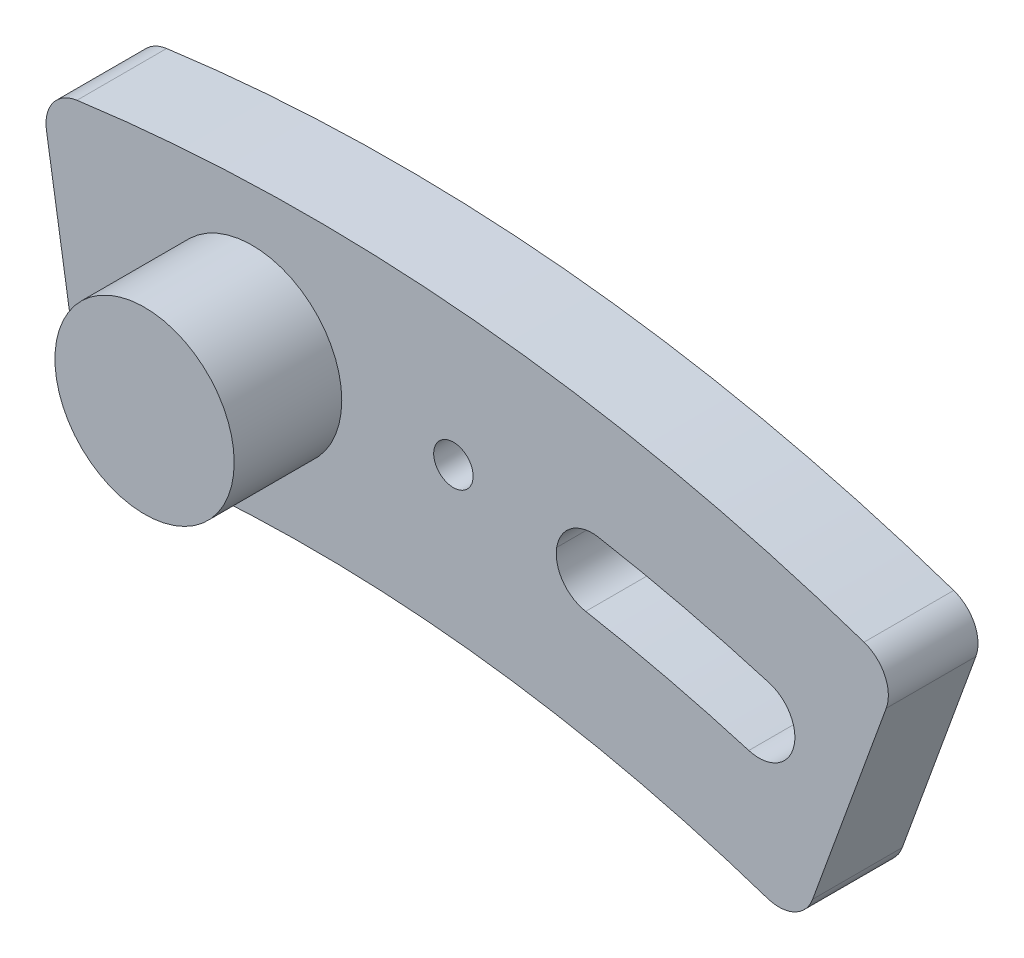
ISO-10303-21;
HEADER;
FILE_DESCRIPTION(('STEP AP214'),'2;1');
FILE_NAME('part.step','',(''),(''),'','','');
FILE_SCHEMA(('AUTOMOTIVE_DESIGN { 1 0 10303 214 1 1 1 1 }'));
ENDSEC;
DATA;
#1=APPLICATION_CONTEXT('core data for automotive mechanical design processes');
#2=APPLICATION_PROTOCOL_DEFINITION('international standard','automotive_design',2000,#1);
#3=PRODUCT_CONTEXT('',#1,'mechanical');
#4=PRODUCT('Part','Part','',(#3));
#5=PRODUCT_RELATED_PRODUCT_CATEGORY('part','',(#4));
#6=PRODUCT_DEFINITION_FORMATION('','',#4);
#7=PRODUCT_DEFINITION_CONTEXT('part definition',#1,'design');
#8=PRODUCT_DEFINITION('design','',#6,#7);
#9=PRODUCT_DEFINITION_SHAPE('','',#8);
#10=(LENGTH_UNIT() NAMED_UNIT(*) SI_UNIT(.MILLI.,.METRE.));
#11=(NAMED_UNIT(*) PLANE_ANGLE_UNIT() SI_UNIT($,.RADIAN.));
#12=(NAMED_UNIT(*) SI_UNIT($,.STERADIAN.) SOLID_ANGLE_UNIT());
#13=UNCERTAINTY_MEASURE_WITH_UNIT(LENGTH_MEASURE(1.E-05),#10,'distance_accuracy_value','');
#14=(GEOMETRIC_REPRESENTATION_CONTEXT(3) GLOBAL_UNCERTAINTY_ASSIGNED_CONTEXT((#13)) GLOBAL_UNIT_ASSIGNED_CONTEXT((#10,
#11,#12)) REPRESENTATION_CONTEXT('',''));
#15=CARTESIAN_POINT('',(0.,0.,0.));
#16=DIRECTION('',(0.,0.,1.));
#17=DIRECTION('',(1.,0.,0.));
#18=AXIS2_PLACEMENT_3D('',#15,#16,#17);
#19=CARTESIAN_POINT('',(-1.40859546249317E-12,2.51187959321442E-12,5.));
#20=DIRECTION('',(0.,0.,1.));
#21=DIRECTION('',(1.,0.,0.));
#22=AXIS2_PLACEMENT_3D('',#19,#20,#21);
#23=PLANE('',#22);
#24=CARTESIAN_POINT('',(-3.22698514229599,88.0000000000025,5.));
#25=DIRECTION('',(0.,0.,1.));
#26=DIRECTION('',(1.,0.,0.));
#27=AXIS2_PLACEMENT_3D('',#24,#25,#26);
#28=CIRCLE('',#27,5.);
#29=CARTESIAN_POINT('',(1.77301485770401,88.0000000000025,5.));
#30=VERTEX_POINT('',#29);
#31=EDGE_CURVE('E160',#30,#30,#28,.F.);
#32=ORIENTED_EDGE('',*,*,#31,.T.);
#33=EDGE_LOOP('',(#32));
#34=FACE_BOUND('',#33,.T.);
#35=DIRECTION('',(0.156434465040231,-0.987688340595138,0.));
#36=VECTOR('',#35,1.);
#37=CARTESIAN_POINT('',(-15.0177086438636,94.8180806971357,5.));
#38=LINE('',#37,#36);
#39=CARTESIAN_POINT('',(-14.7015109441392,92.8216869915639,5.));
#40=VERTEX_POINT('',#39);
#41=CARTESIAN_POINT('',(-12.8238100909332,80.9663503855282,5.));
#42=VERTEX_POINT('',#41);
#43=EDGE_CURVE('E195',#40,#42,#38,.T.);
#44=ORIENTED_EDGE('',*,*,#43,.T.);
#45=CARTESIAN_POINT('',(-10.8484334097429,81.2792193156087,5.));
#46=DIRECTION('',(0.,0.,1.));
#47=DIRECTION('',(1.,0.,0.));
#48=AXIS2_PLACEMENT_3D('',#45,#46,#47);
#49=CIRCLE('',#48,2.);
#50=CARTESIAN_POINT('',(-10.58383747292,79.2967993323012,5.));
#51=VERTEX_POINT('',#50);
#52=EDGE_CURVE('E238',#42,#51,#49,.T.);
#53=ORIENTED_EDGE('',*,*,#52,.T.);
#54=CARTESIAN_POINT('',(-1.40859546249317E-12,2.51187959321442E-12,5.));
#55=DIRECTION('',(0.,0.,1.));
#56=DIRECTION('',(1.,0.,0.));
#57=AXIS2_PLACEMENT_3D('',#54,#55,#56);
#58=CIRCLE('',#57,80.);
#59=CARTESIAN_POINT('',(25.5199251857789,75.8204023895453,5.));
#60=VERTEX_POINT('',#59);
#61=EDGE_CURVE('E147',#60,#51,#58,.T.);
#62=ORIENTED_EDGE('',*,*,#61,.F.);
#63=CARTESIAN_POINT('',(26.1579233154234,77.7159124492838,5.));
#64=DIRECTION('',(0.,0.,1.));
#65=DIRECTION('',(1.,0.,0.));
#66=AXIS2_PLACEMENT_3D('',#63,#64,#65);
#67=CIRCLE('',#66,2.);
#68=CARTESIAN_POINT('',(28.0373085569952,77.0318721626325,5.));
#69=VERTEX_POINT('',#68);
#70=EDGE_CURVE('E234',#60,#69,#67,.T.);
#71=ORIENTED_EDGE('',*,*,#70,.T.);
#72=DIRECTION('',(0.342020143325669,0.939692620785908,0.));
#73=VECTOR('',#72,1.);
#74=CARTESIAN_POINT('',(27.3616114660521,75.1754096628752,5.));
#75=LINE('',#74,#73);
#76=CARTESIAN_POINT('',(32.1426156245335,88.3111106306214,5.));
#77=VERTEX_POINT('',#76);
#78=EDGE_CURVE('E188',#69,#77,#75,.T.);
#79=ORIENTED_EDGE('',*,*,#78,.T.);
#80=CARTESIAN_POINT('',(30.2632303829617,88.9951509172727,5.));
#81=DIRECTION('',(0.,0.,1.));
#82=DIRECTION('',(1.,0.,0.));
#83=AXIS2_PLACEMENT_3D('',#80,#81,#82);
#84=CIRCLE('',#83,2.);
#85=CARTESIAN_POINT('',(30.9071289017482,90.8886647665764,5.));
#86=VERTEX_POINT('',#85);
#87=EDGE_CURVE('E232',#77,#86,#84,.T.);
#88=ORIENTED_EDGE('',*,*,#87,.T.);
#89=CARTESIAN_POINT('',(-1.40859546249317E-12,2.51187959321442E-12,5.));
#90=DIRECTION('',(0.,0.,1.));
#91=DIRECTION('',(1.,0.,0.));
#92=AXIS2_PLACEMENT_3D('',#89,#90,#91);
#93=CIRCLE('',#92,96.);
#94=CARTESIAN_POINT('',(-12.9969030770542,95.1161422178495,5.));
#95=VERTEX_POINT('',#94);
#96=EDGE_CURVE('E191',#86,#95,#93,.T.);
#97=ORIENTED_EDGE('',*,*,#96,.T.);
#98=CARTESIAN_POINT('',(-12.7261342629489,93.1345559216444,5.));
#99=DIRECTION('',(0.,0.,1.));
#100=DIRECTION('',(1.,0.,0.));
#101=AXIS2_PLACEMENT_3D('',#98,#99,#100);
#102=CIRCLE('',#101,2.);
#103=EDGE_CURVE('E236',#95,#40,#102,.T.);
#104=ORIENTED_EDGE('',*,*,#103,.T.);
#105=EDGE_LOOP('',(#44,#53,#62,#71,#79,#88,#97,#104));
#106=FACE_BOUND('',#105,.T.);
#107=CARTESIAN_POINT('',(7.99999999999859,88.0000000000025,5.));
#108=DIRECTION('',(0.,0.,1.));
#109=DIRECTION('',(1.,0.,0.));
#110=AXIS2_PLACEMENT_3D('',#107,#108,#109);
#111=CIRCLE('',#110,1.10000000000062);
#112=CARTESIAN_POINT('',(9.09999999999921,88.0000000000025,5.));
#113=VERTEX_POINT('',#112);
#114=EDGE_CURVE('E153',#113,#113,#111,.F.);
#115=ORIENTED_EDGE('',*,*,#114,.T.);
#116=EDGE_LOOP('',(#115));
#117=FACE_BOUND('',#116,.T.);
#118=CARTESIAN_POINT('',(-1.40859546249317E-12,2.51187959321442E-12,5.));
#119=DIRECTION('',(0.,0.,1.));
#120=DIRECTION('',(1.,0.,0.));
#121=AXIS2_PLACEMENT_3D('',#118,#119,#120);
#122=CIRCLE('',#121,90.);
#123=CARTESIAN_POINT('',(16.0957368580438,88.5490104687625,5.));
#124=VERTEX_POINT('',#123);
#125=CARTESIAN_POINT('',(25.6174844033101,86.2771377182074,5.));
#126=VERTEX_POINT('',#125);
#127=EDGE_CURVE('E152',#124,#126,#122,.F.);
#128=ORIENTED_EDGE('',*,*,#127,.T.);
#129=CARTESIAN_POINT('',(25.0482069721254,84.3598679911362,5.));
#130=DIRECTION('',(0.,0.,1.));
#131=DIRECTION('',(1.,0.,0.));
#132=AXIS2_PLACEMENT_3D('',#129,#130,#131);
#133=CIRCLE('',#132,2.);
#134=CARTESIAN_POINT('',(26.9520433491665,83.7471632910931,5.));
#135=VERTEX_POINT('',#134);
#136=EDGE_CURVE('E169',#126,#135,#133,.F.);
#137=ORIENTED_EDGE('',*,*,#136,.T.);
#138=CARTESIAN_POINT('',(25.0482069721254,84.3598679911362,5.));
#139=DIRECTION('',(0.,0.,1.));
#140=DIRECTION('',(1.,0.,0.));
#141=AXIS2_PLACEMENT_3D('',#138,#139,#140);
#142=CIRCLE('',#141,2.);
#143=CARTESIAN_POINT('',(24.4789295409407,82.442598264065,5.));
#144=VERTEX_POINT('',#143);
#145=EDGE_CURVE('E151',#135,#144,#142,.F.);
#146=ORIENTED_EDGE('',*,*,#145,.T.);
#147=CARTESIAN_POINT('',(-1.40859546249317E-12,2.51187959321442E-12,5.));
#148=DIRECTION('',(0.,0.,1.));
#149=DIRECTION('',(1.,0.,0.));
#150=AXIS2_PLACEMENT_3D('',#147,#148,#149);
#151=CIRCLE('',#150,86.);
#152=CARTESIAN_POINT('',(15.380370775464,84.6134988923732,5.));
#153=VERTEX_POINT('',#152);
#154=EDGE_CURVE('E141',#153,#144,#151,.F.);
#155=ORIENTED_EDGE('',*,*,#154,.F.);
#156=CARTESIAN_POINT('',(15.7380538167539,86.5812546805678,5.));
#157=DIRECTION('',(0.,0.,1.));
#158=DIRECTION('',(1.,0.,0.));
#159=AXIS2_PLACEMENT_3D('',#156,#157,#158);
#160=CIRCLE('',#159,2.);
#161=CARTESIAN_POINT('',(13.7626771355636,86.8941236106483,5.));
#162=VERTEX_POINT('',#161);
#163=EDGE_CURVE('E11',#153,#162,#160,.F.);
#164=ORIENTED_EDGE('',*,*,#163,.T.);
#165=CARTESIAN_POINT('',(15.7380538167539,86.5812546805679,5.));
#166=DIRECTION('',(0.,0.,1.));
#167=DIRECTION('',(1.,0.,0.));
#168=AXIS2_PLACEMENT_3D('',#165,#166,#167);
#169=CIRCLE('',#168,2.);
#170=EDGE_CURVE('E162',#162,#124,#169,.F.);
#171=ORIENTED_EDGE('',*,*,#170,.T.);
#172=EDGE_LOOP('',(#128,#137,#146,#155,#164,#171));
#173=FACE_BOUND('',#172,.T.);
#174=ADVANCED_FACE('F35',(#34,#106,#117,#173),#23,.T.);
#175=CARTESIAN_POINT('',(-1.40859546249317E-12,2.51187959321442E-12,0.));
#176=DIRECTION('',(0.,0.,1.));
#177=DIRECTION('',(1.,0.,0.));
#178=AXIS2_PLACEMENT_3D('',#175,#176,#177);
#179=PLANE('',#178);
#180=CARTESIAN_POINT('',(7.99999999999859,88.0000000000025,0.));
#181=DIRECTION('',(0.,0.,1.));
#182=DIRECTION('',(1.,0.,0.));
#183=AXIS2_PLACEMENT_3D('',#180,#181,#182);
#184=CIRCLE('',#183,1.10000000000062);
#185=CARTESIAN_POINT('',(9.09999999999921,88.0000000000025,0.));
#186=VERTEX_POINT('',#185);
#187=EDGE_CURVE('E173',#186,#186,#184,.T.);
#188=ORIENTED_EDGE('',*,*,#187,.T.);
#189=EDGE_LOOP('',(#188));
#190=FACE_BOUND('',#189,.T.);
#191=CARTESIAN_POINT('',(-1.40859546249317E-12,2.51187959321442E-12,0.));
#192=DIRECTION('',(0.,0.,1.));
#193=DIRECTION('',(1.,0.,0.));
#194=AXIS2_PLACEMENT_3D('',#191,#192,#193);
#195=CIRCLE('',#194,80.);
#196=CARTESIAN_POINT('',(25.5199251857789,75.8204023895453,0.));
#197=VERTEX_POINT('',#196);
#198=CARTESIAN_POINT('',(-10.58383747292,79.2967993323012,0.));
#199=VERTEX_POINT('',#198);
#200=EDGE_CURVE('E192',#197,#199,#195,.T.);
#201=ORIENTED_EDGE('',*,*,#200,.T.);
#202=CARTESIAN_POINT('',(-10.8484334097429,81.2792193156087,0.));
#203=DIRECTION('',(0.,0.,1.));
#204=DIRECTION('',(1.,0.,0.));
#205=AXIS2_PLACEMENT_3D('',#202,#203,#204);
#206=CIRCLE('',#205,2.);
#207=CARTESIAN_POINT('',(-12.8238100909332,80.9663503855282,0.));
#208=VERTEX_POINT('',#207);
#209=EDGE_CURVE('E225',#199,#208,#206,.F.);
#210=ORIENTED_EDGE('',*,*,#209,.T.);
#211=DIRECTION('',(0.156434465040231,-0.987688340595138,0.));
#212=VECTOR('',#211,1.);
#213=CARTESIAN_POINT('',(-15.0177086438636,94.8180806971357,0.));
#214=LINE('',#213,#212);
#215=CARTESIAN_POINT('',(-14.7015109441392,92.8216869915639,0.));
#216=VERTEX_POINT('',#215);
#217=EDGE_CURVE('E205',#216,#208,#214,.T.);
#218=ORIENTED_EDGE('',*,*,#217,.F.);
#219=CARTESIAN_POINT('',(-12.7261342629489,93.1345559216444,0.));
#220=DIRECTION('',(0.,0.,1.));
#221=DIRECTION('',(1.,0.,0.));
#222=AXIS2_PLACEMENT_3D('',#219,#220,#221);
#223=CIRCLE('',#222,2.);
#224=CARTESIAN_POINT('',(-12.9969030770542,95.1161422178495,0.));
#225=VERTEX_POINT('',#224);
#226=EDGE_CURVE('E223',#216,#225,#223,.F.);
#227=ORIENTED_EDGE('',*,*,#226,.T.);
#228=CARTESIAN_POINT('',(-1.40859546249317E-12,2.51187959321442E-12,0.));
#229=DIRECTION('',(0.,0.,1.));
#230=DIRECTION('',(1.,0.,0.));
#231=AXIS2_PLACEMENT_3D('',#228,#229,#230);
#232=CIRCLE('',#231,96.);
#233=CARTESIAN_POINT('',(30.9071289017482,90.8886647665764,0.));
#234=VERTEX_POINT('',#233);
#235=EDGE_CURVE('E202',#234,#225,#232,.T.);
#236=ORIENTED_EDGE('',*,*,#235,.F.);
#237=CARTESIAN_POINT('',(30.2632303829617,88.9951509172727,0.));
#238=DIRECTION('',(0.,0.,1.));
#239=DIRECTION('',(1.,0.,0.));
#240=AXIS2_PLACEMENT_3D('',#237,#238,#239);
#241=CIRCLE('',#240,2.);
#242=CARTESIAN_POINT('',(32.1426156245335,88.3111106306214,0.));
#243=VERTEX_POINT('',#242);
#244=EDGE_CURVE('E219',#234,#243,#241,.F.);
#245=ORIENTED_EDGE('',*,*,#244,.T.);
#246=DIRECTION('',(0.342020143325669,0.939692620785908,0.));
#247=VECTOR('',#246,1.);
#248=CARTESIAN_POINT('',(27.3616114660521,75.1754096628752,0.));
#249=LINE('',#248,#247);
#250=CARTESIAN_POINT('',(28.0373085569952,77.0318721626325,0.));
#251=VERTEX_POINT('',#250);
#252=EDGE_CURVE('E187',#251,#243,#249,.T.);
#253=ORIENTED_EDGE('',*,*,#252,.F.);
#254=CARTESIAN_POINT('',(26.1579233154234,77.7159124492838,0.));
#255=DIRECTION('',(0.,0.,1.));
#256=DIRECTION('',(1.,0.,0.));
#257=AXIS2_PLACEMENT_3D('',#254,#255,#256);
#258=CIRCLE('',#257,2.);
#259=EDGE_CURVE('E221',#251,#197,#258,.F.);
#260=ORIENTED_EDGE('',*,*,#259,.T.);
#261=EDGE_LOOP('',(#201,#210,#218,#227,#236,#245,#253,#260));
#262=FACE_BOUND('',#261,.T.);
#263=CARTESIAN_POINT('',(25.0482069721254,84.3598679911362,0.));
#264=DIRECTION('',(0.,0.,1.));
#265=DIRECTION('',(1.,0.,0.));
#266=AXIS2_PLACEMENT_3D('',#263,#264,#265);
#267=CIRCLE('',#266,2.);
#268=CARTESIAN_POINT('',(24.4789295409407,82.442598264065,0.));
#269=VERTEX_POINT('',#268);
#270=CARTESIAN_POINT('',(26.9520433491665,83.7471632910931,0.));
#271=VERTEX_POINT('',#270);
#272=EDGE_CURVE('E250',#269,#271,#267,.T.);
#273=ORIENTED_EDGE('',*,*,#272,.T.);
#274=CARTESIAN_POINT('',(25.0482069721254,84.3598679911362,0.));
#275=DIRECTION('',(0.,0.,1.));
#276=DIRECTION('',(1.,0.,0.));
#277=AXIS2_PLACEMENT_3D('',#274,#275,#276);
#278=CIRCLE('',#277,2.);
#279=CARTESIAN_POINT('',(25.6174844033101,86.2771377182074,0.));
#280=VERTEX_POINT('',#279);
#281=EDGE_CURVE('E253',#271,#280,#278,.T.);
#282=ORIENTED_EDGE('',*,*,#281,.T.);
#283=CARTESIAN_POINT('',(-1.40859546249317E-12,2.51187959321442E-12,0.));
#284=DIRECTION('',(0.,0.,1.));
#285=DIRECTION('',(1.,0.,0.));
#286=AXIS2_PLACEMENT_3D('',#283,#284,#285);
#287=CIRCLE('',#286,90.);
#288=CARTESIAN_POINT('',(16.0957368580438,88.5490104687625,0.));
#289=VERTEX_POINT('',#288);
#290=EDGE_CURVE('E177',#280,#289,#287,.T.);
#291=ORIENTED_EDGE('',*,*,#290,.T.);
#292=CARTESIAN_POINT('',(15.7380538167539,86.5812546805679,0.));
#293=DIRECTION('',(0.,0.,1.));
#294=DIRECTION('',(1.,0.,0.));
#295=AXIS2_PLACEMENT_3D('',#292,#293,#294);
#296=CIRCLE('',#295,2.);
#297=CARTESIAN_POINT('',(13.7626771355636,86.8941236106483,0.));
#298=VERTEX_POINT('',#297);
#299=EDGE_CURVE('E58',#289,#298,#296,.T.);
#300=ORIENTED_EDGE('',*,*,#299,.T.);
#301=CARTESIAN_POINT('',(15.7380538167539,86.5812546805678,0.));
#302=DIRECTION('',(0.,0.,1.));
#303=DIRECTION('',(1.,0.,0.));
#304=AXIS2_PLACEMENT_3D('',#301,#302,#303);
#305=CIRCLE('',#304,2.);
#306=CARTESIAN_POINT('',(15.380370775464,84.6134988923732,0.));
#307=VERTEX_POINT('',#306);
#308=EDGE_CURVE('E44',#298,#307,#305,.T.);
#309=ORIENTED_EDGE('',*,*,#308,.T.);
#310=CARTESIAN_POINT('',(-1.40859546249317E-12,2.51187959321442E-12,0.));
#311=DIRECTION('',(0.,0.,1.));
#312=DIRECTION('',(1.,0.,0.));
#313=AXIS2_PLACEMENT_3D('',#310,#311,#312);
#314=CIRCLE('',#313,86.);
#315=EDGE_CURVE('E144',#269,#307,#314,.T.);
#316=ORIENTED_EDGE('',*,*,#315,.F.);
#317=EDGE_LOOP('',(#273,#282,#291,#300,#309,#316));
#318=FACE_BOUND('',#317,.T.);
#319=ADVANCED_FACE('F260',(#190,#262,#318),#179,.F.);
#320=CARTESIAN_POINT('',(27.3616114660521,75.1754096628752,5.));
#321=DIRECTION('',(-0.939692620785908,0.342020143325669,0.));
#322=DIRECTION('',(-0.342020143325669,-0.939692620785908,0.));
#323=AXIS2_PLACEMENT_3D('',#320,#321,#322);
#324=PLANE('',#323);
#325=ORIENTED_EDGE('',*,*,#78,.F.);
#326=DIRECTION('',(0.,0.,1.));
#327=VECTOR('',#326,1.);
#328=CARTESIAN_POINT('',(28.0373085569952,77.0318721626325,0.));
#329=LINE('',#328,#327);
#330=EDGE_CURVE('E247',#69,#251,#329,.F.);
#331=ORIENTED_EDGE('',*,*,#330,.T.);
#332=ORIENTED_EDGE('',*,*,#252,.T.);
#333=DIRECTION('',(0.,0.,-1.));
#334=VECTOR('',#333,1.);
#335=CARTESIAN_POINT('',(32.1426156245335,88.3111106306214,5.));
#336=LINE('',#335,#334);
#337=EDGE_CURVE('E245',#243,#77,#336,.F.);
#338=ORIENTED_EDGE('',*,*,#337,.T.);
#339=EDGE_LOOP('',(#325,#331,#332,#338));
#340=FACE_BOUND('',#339,.T.);
#341=ADVANCED_FACE('F281',(#340),#324,.F.);
#342=CARTESIAN_POINT('',(-1.40859546249317E-12,2.51187959321442E-12,5.));
#343=DIRECTION('',(0.,0.,-1.));
#344=DIRECTION('',(-1.,0.,0.));
#345=AXIS2_PLACEMENT_3D('',#342,#343,#344);
#346=CYLINDRICAL_SURFACE('',#345,96.);
#347=ORIENTED_EDGE('',*,*,#235,.T.);
#348=DIRECTION('',(0.,0.,-1.));
#349=VECTOR('',#348,1.);
#350=CARTESIAN_POINT('',(-12.9969030770542,95.1161422178495,5.));
#351=LINE('',#350,#349);
#352=EDGE_CURVE('E243',#225,#95,#351,.F.);
#353=ORIENTED_EDGE('',*,*,#352,.T.);
#354=ORIENTED_EDGE('',*,*,#96,.F.);
#355=DIRECTION('',(0.,0.,-1.));
#356=VECTOR('',#355,1.);
#357=CARTESIAN_POINT('',(30.9071289017482,90.8886647665763,5.));
#358=LINE('',#357,#356);
#359=EDGE_CURVE('E240',#86,#234,#358,.T.);
#360=ORIENTED_EDGE('',*,*,#359,.T.);
#361=EDGE_LOOP('',(#347,#353,#354,#360));
#362=FACE_BOUND('',#361,.T.);
#363=ADVANCED_FACE('F292',(#362),#346,.T.);
#364=CARTESIAN_POINT('',(-15.0177086438636,94.8180806971357,5.));
#365=DIRECTION('',(0.987688340595138,0.156434465040231,0.));
#366=DIRECTION('',(-0.156434465040231,0.987688340595138,0.));
#367=AXIS2_PLACEMENT_3D('',#364,#365,#366);
#368=PLANE('',#367);
#369=ORIENTED_EDGE('',*,*,#217,.T.);
#370=DIRECTION('',(0.,0.,1.));
#371=VECTOR('',#370,1.);
#372=CARTESIAN_POINT('',(-12.8238100909332,80.9663503855282,5.));
#373=LINE('',#372,#371);
#374=EDGE_CURVE('E230',#208,#42,#373,.T.);
#375=ORIENTED_EDGE('',*,*,#374,.T.);
#376=ORIENTED_EDGE('',*,*,#43,.F.);
#377=DIRECTION('',(0.,0.,-1.));
#378=VECTOR('',#377,1.);
#379=CARTESIAN_POINT('',(-14.7015109441392,92.8216869915639,5.));
#380=LINE('',#379,#378);
#381=EDGE_CURVE('E227',#40,#216,#380,.T.);
#382=ORIENTED_EDGE('',*,*,#381,.T.);
#383=EDGE_LOOP('',(#369,#375,#376,#382));
#384=FACE_BOUND('',#383,.T.);
#385=ADVANCED_FACE('F288',(#384),#368,.F.);
#386=CARTESIAN_POINT('',(-1.40859546249317E-12,2.51187959321442E-12,5.));
#387=DIRECTION('',(0.,0.,-1.));
#388=DIRECTION('',(-1.,0.,0.));
#389=AXIS2_PLACEMENT_3D('',#386,#387,#388);
#390=CYLINDRICAL_SURFACE('',#389,80.);
#391=ORIENTED_EDGE('',*,*,#61,.T.);
#392=DIRECTION('',(0.,0.,-1.));
#393=VECTOR('',#392,1.);
#394=CARTESIAN_POINT('',(-10.58383747292,79.2967993323012,5.));
#395=LINE('',#394,#393);
#396=EDGE_CURVE('E216',#51,#199,#395,.T.);
#397=ORIENTED_EDGE('',*,*,#396,.T.);
#398=ORIENTED_EDGE('',*,*,#200,.F.);
#399=DIRECTION('',(0.,0.,-1.));
#400=VECTOR('',#399,1.);
#401=CARTESIAN_POINT('',(25.5199251857789,75.8204023895453,5.));
#402=LINE('',#401,#400);
#403=EDGE_CURVE('E214',#197,#60,#402,.F.);
#404=ORIENTED_EDGE('',*,*,#403,.T.);
#405=EDGE_LOOP('',(#391,#397,#398,#404));
#406=FACE_BOUND('',#405,.T.);
#407=ADVANCED_FACE('F272',(#406),#390,.F.);
#408=CARTESIAN_POINT('',(7.99999999999859,88.0000000000025,10.));
#409=DIRECTION('',(0.,0.,-1.));
#410=DIRECTION('',(-1.,0.,0.));
#411=AXIS2_PLACEMENT_3D('',#408,#409,#410);
#412=CYLINDRICAL_SURFACE('',#411,1.10000000000062);
#413=ORIENTED_EDGE('',*,*,#114,.F.);
#414=EDGE_LOOP('',(#413));
#415=FACE_BOUND('',#414,.T.);
#416=ORIENTED_EDGE('',*,*,#187,.F.);
#417=EDGE_LOOP('',(#416));
#418=FACE_BOUND('',#417,.T.);
#419=ADVANCED_FACE('F265',(#415,#418),#412,.F.);
#420=CARTESIAN_POINT('',(-1.40859546249317E-12,2.51187959321442E-12,10.));
#421=DIRECTION('',(0.,0.,-1.));
#422=DIRECTION('',(-1.,0.,0.));
#423=AXIS2_PLACEMENT_3D('',#420,#421,#422);
#424=CYLINDRICAL_SURFACE('',#423,90.);
#425=ORIENTED_EDGE('',*,*,#290,.F.);
#426=DIRECTION('',(0.,0.,-1.));
#427=VECTOR('',#426,1.);
#428=CARTESIAN_POINT('',(25.6174844033101,86.2771377182074,10.));
#429=LINE('',#428,#427);
#430=EDGE_CURVE('E212',#280,#126,#429,.F.);
#431=ORIENTED_EDGE('',*,*,#430,.T.);
#432=ORIENTED_EDGE('',*,*,#127,.F.);
#433=DIRECTION('',(0.,0.,-1.));
#434=VECTOR('',#433,1.);
#435=CARTESIAN_POINT('',(16.0957368580438,88.5490104687625,10.));
#436=LINE('',#435,#434);
#437=EDGE_CURVE('E165',#124,#289,#436,.T.);
#438=ORIENTED_EDGE('',*,*,#437,.T.);
#439=EDGE_LOOP('',(#425,#431,#432,#438));
#440=FACE_BOUND('',#439,.T.);
#441=ADVANCED_FACE('F263',(#440),#424,.F.);
#442=CARTESIAN_POINT('',(-1.40859546249317E-12,2.51187959321442E-12,10.));
#443=DIRECTION('',(0.,0.,-1.));
#444=DIRECTION('',(-1.,0.,0.));
#445=AXIS2_PLACEMENT_3D('',#442,#443,#444);
#446=CYLINDRICAL_SURFACE('',#445,86.);
#447=ORIENTED_EDGE('',*,*,#154,.T.);
#448=DIRECTION('',(0.,0.,-1.));
#449=VECTOR('',#448,1.);
#450=CARTESIAN_POINT('',(24.4789295409407,82.442598264065,10.));
#451=LINE('',#450,#449);
#452=EDGE_CURVE('E146',#144,#269,#451,.T.);
#453=ORIENTED_EDGE('',*,*,#452,.T.);
#454=ORIENTED_EDGE('',*,*,#315,.T.);
#455=DIRECTION('',(0.,0.,-1.));
#456=VECTOR('',#455,1.);
#457=CARTESIAN_POINT('',(15.380370775464,84.6134988923732,10.));
#458=LINE('',#457,#456);
#459=EDGE_CURVE('E138',#307,#153,#458,.F.);
#460=ORIENTED_EDGE('',*,*,#459,.T.);
#461=EDGE_LOOP('',(#447,#453,#454,#460));
#462=FACE_BOUND('',#461,.T.);
#463=ADVANCED_FACE('F139',(#462),#446,.T.);
#464=CARTESIAN_POINT('',(25.0482069721254,84.3598679911362,10.));
#465=DIRECTION('',(0.,0.,-1.));
#466=DIRECTION('',(-1.,0.,0.));
#467=AXIS2_PLACEMENT_3D('',#464,#465,#466);
#468=CYLINDRICAL_SURFACE('',#467,2.);
#469=DIRECTION('',(0.,0.,-1.));
#470=VECTOR('',#469,1.);
#471=CARTESIAN_POINT('',(26.9520433491665,83.7471632910931,10.));
#472=LINE('',#471,#470);
#473=EDGE_CURVE('E159',#135,#271,#472,.T.);
#474=ORIENTED_EDGE('',*,*,#473,.F.);
#475=ORIENTED_EDGE('',*,*,#136,.F.);
#476=ORIENTED_EDGE('',*,*,#430,.F.);
#477=ORIENTED_EDGE('',*,*,#281,.F.);
#478=EDGE_LOOP('',(#474,#475,#476,#477));
#479=FACE_BOUND('',#478,.T.);
#480=ADVANCED_FACE('F258',(#479),#468,.F.);
#481=CARTESIAN_POINT('',(25.0482069721254,84.3598679911362,10.));
#482=DIRECTION('',(0.,0.,-1.));
#483=DIRECTION('',(-1.,0.,0.));
#484=AXIS2_PLACEMENT_3D('',#481,#482,#483);
#485=CYLINDRICAL_SURFACE('',#484,2.);
#486=ORIENTED_EDGE('',*,*,#145,.F.);
#487=ORIENTED_EDGE('',*,*,#473,.T.);
#488=ORIENTED_EDGE('',*,*,#272,.F.);
#489=ORIENTED_EDGE('',*,*,#452,.F.);
#490=EDGE_LOOP('',(#486,#487,#488,#489));
#491=FACE_BOUND('',#490,.T.);
#492=ADVANCED_FACE('F259',(#491),#485,.F.);
#493=CARTESIAN_POINT('',(15.7380538167539,86.5812546805678,10.));
#494=DIRECTION('',(0.,0.,-1.));
#495=DIRECTION('',(-1.,0.,0.));
#496=AXIS2_PLACEMENT_3D('',#493,#494,#495);
#497=CYLINDRICAL_SURFACE('',#496,2.);
#498=DIRECTION('',(0.,0.,-1.));
#499=VECTOR('',#498,1.);
#500=CARTESIAN_POINT('',(13.7626771355636,86.8941236106483,10.));
#501=LINE('',#500,#499);
#502=EDGE_CURVE('E39',#162,#298,#501,.T.);
#503=ORIENTED_EDGE('',*,*,#502,.F.);
#504=ORIENTED_EDGE('',*,*,#163,.F.);
#505=ORIENTED_EDGE('',*,*,#459,.F.);
#506=ORIENTED_EDGE('',*,*,#308,.F.);
#507=EDGE_LOOP('',(#503,#504,#505,#506));
#508=FACE_BOUND('',#507,.T.);
#509=ADVANCED_FACE('F155',(#508),#497,.F.);
#510=CARTESIAN_POINT('',(15.7380538167539,86.5812546805679,10.));
#511=DIRECTION('',(0.,0.,-1.));
#512=DIRECTION('',(-1.,0.,0.));
#513=AXIS2_PLACEMENT_3D('',#510,#511,#512);
#514=CYLINDRICAL_SURFACE('',#513,2.);
#515=ORIENTED_EDGE('',*,*,#170,.F.);
#516=ORIENTED_EDGE('',*,*,#502,.T.);
#517=ORIENTED_EDGE('',*,*,#299,.F.);
#518=ORIENTED_EDGE('',*,*,#437,.F.);
#519=EDGE_LOOP('',(#515,#516,#517,#518));
#520=FACE_BOUND('',#519,.T.);
#521=ADVANCED_FACE('F163',(#520),#514,.F.);
#522=CARTESIAN_POINT('',(-10.8484334097429,81.2792193156087,5.));
#523=DIRECTION('',(0.,0.,-1.));
#524=DIRECTION('',(-1.,0.,0.));
#525=AXIS2_PLACEMENT_3D('',#522,#523,#524);
#526=CYLINDRICAL_SURFACE('',#525,2.);
#527=ORIENTED_EDGE('',*,*,#52,.F.);
#528=ORIENTED_EDGE('',*,*,#374,.F.);
#529=ORIENTED_EDGE('',*,*,#209,.F.);
#530=ORIENTED_EDGE('',*,*,#396,.F.);
#531=EDGE_LOOP('',(#527,#528,#529,#530));
#532=FACE_BOUND('',#531,.T.);
#533=ADVANCED_FACE('F306',(#532),#526,.T.);
#534=CARTESIAN_POINT('',(-12.7261342629489,93.1345559216444,5.));
#535=DIRECTION('',(0.,0.,-1.));
#536=DIRECTION('',(-1.,0.,0.));
#537=AXIS2_PLACEMENT_3D('',#534,#535,#536);
#538=CYLINDRICAL_SURFACE('',#537,2.);
#539=ORIENTED_EDGE('',*,*,#103,.F.);
#540=ORIENTED_EDGE('',*,*,#352,.F.);
#541=ORIENTED_EDGE('',*,*,#226,.F.);
#542=ORIENTED_EDGE('',*,*,#381,.F.);
#543=EDGE_LOOP('',(#539,#540,#541,#542));
#544=FACE_BOUND('',#543,.T.);
#545=ADVANCED_FACE('F311',(#544),#538,.T.);
#546=CARTESIAN_POINT('',(26.1579233154234,77.7159124492838,5.));
#547=DIRECTION('',(0.,0.,-1.));
#548=DIRECTION('',(-1.,0.,0.));
#549=AXIS2_PLACEMENT_3D('',#546,#547,#548);
#550=CYLINDRICAL_SURFACE('',#549,2.);
#551=ORIENTED_EDGE('',*,*,#70,.F.);
#552=ORIENTED_EDGE('',*,*,#403,.F.);
#553=ORIENTED_EDGE('',*,*,#259,.F.);
#554=ORIENTED_EDGE('',*,*,#330,.F.);
#555=EDGE_LOOP('',(#551,#552,#553,#554));
#556=FACE_BOUND('',#555,.T.);
#557=ADVANCED_FACE('F314',(#556),#550,.T.);
#558=CARTESIAN_POINT('',(30.2632303829617,88.9951509172727,5.));
#559=DIRECTION('',(0.,0.,-1.));
#560=DIRECTION('',(-1.,0.,0.));
#561=AXIS2_PLACEMENT_3D('',#558,#559,#560);
#562=CYLINDRICAL_SURFACE('',#561,2.);
#563=ORIENTED_EDGE('',*,*,#87,.F.);
#564=ORIENTED_EDGE('',*,*,#337,.F.);
#565=ORIENTED_EDGE('',*,*,#244,.F.);
#566=ORIENTED_EDGE('',*,*,#359,.F.);
#567=EDGE_LOOP('',(#563,#564,#565,#566));
#568=FACE_BOUND('',#567,.T.);
#569=ADVANCED_FACE('F37',(#568),#562,.T.);
#570=CARTESIAN_POINT('',(-3.22698514229599,88.0000000000025,11.));
#571=DIRECTION('',(0.,0.,-1.));
#572=DIRECTION('',(-1.,0.,0.));
#573=AXIS2_PLACEMENT_3D('',#570,#571,#572);
#574=CYLINDRICAL_SURFACE('',#573,5.);
#575=ORIENTED_EDGE('',*,*,#31,.F.);
#576=EDGE_LOOP('',(#575));
#577=FACE_BOUND('',#576,.T.);
#578=CARTESIAN_POINT('',(-3.22698514229599,88.0000000000025,11.));
#579=DIRECTION('',(0.,0.,1.));
#580=DIRECTION('',(1.,0.,0.));
#581=AXIS2_PLACEMENT_3D('',#578,#579,#580);
#582=CIRCLE('',#581,5.);
#583=CARTESIAN_POINT('',(1.77301485770401,88.0000000000025,11.));
#584=VERTEX_POINT('',#583);
#585=EDGE_CURVE('E362',#584,#584,#582,.T.);
#586=ORIENTED_EDGE('',*,*,#585,.F.);
#587=EDGE_LOOP('',(#586));
#588=FACE_BOUND('',#587,.T.);
#589=ADVANCED_FACE('F321',(#577,#588),#574,.T.);
#590=CARTESIAN_POINT('',(0.,0.,11.));
#591=DIRECTION('',(0.,0.,1.));
#592=DIRECTION('',(1.,0.,0.));
#593=AXIS2_PLACEMENT_3D('',#590,#591,#592);
#594=PLANE('',#593);
#595=ORIENTED_EDGE('',*,*,#585,.T.);
#596=EDGE_LOOP('',(#595));
#597=FACE_BOUND('',#596,.T.);
#598=ADVANCED_FACE('F350',(#597),#594,.T.);
#599=CLOSED_SHELL('',(#174,#319,#341,#363,#385,#407,#419,#441,#463,#480,#492,#509,#521,#533,
#545,#557,#569,#589,#598));
#600=MANIFOLD_SOLID_BREP('B2',#599);
#601=ADVANCED_BREP_SHAPE_REPRESENTATION('',(#18,#600),#14);
#602=SHAPE_DEFINITION_REPRESENTATION(#9,#601);
ENDSEC;
END-ISO-10303-21;
